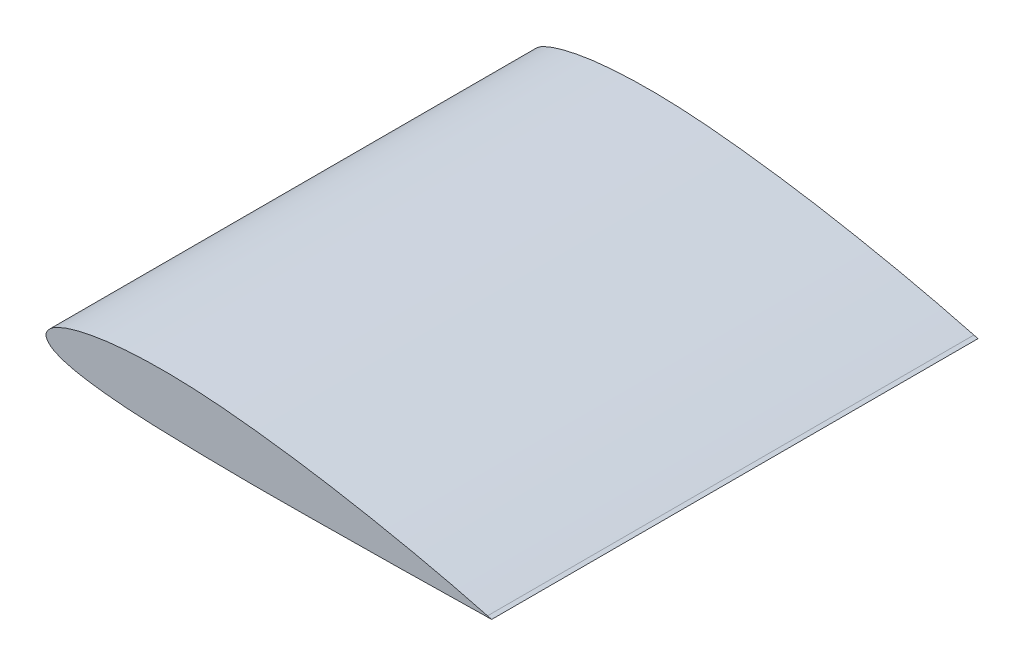
ISO-10303-21;
HEADER;
FILE_DESCRIPTION(('STEP AP214'),'2;1');
FILE_NAME('part.step','',(''),(''),'','','');
FILE_SCHEMA(('AUTOMOTIVE_DESIGN { 1 0 10303 214 1 1 1 1 }'));
ENDSEC;
DATA;
#1=APPLICATION_CONTEXT('core data for automotive mechanical design processes');
#2=APPLICATION_PROTOCOL_DEFINITION('international standard','automotive_design',2000,#1);
#3=PRODUCT_CONTEXT('',#1,'mechanical');
#4=PRODUCT('Part','Part','',(#3));
#5=PRODUCT_RELATED_PRODUCT_CATEGORY('part','',(#4));
#6=PRODUCT_DEFINITION_FORMATION('','',#4);
#7=PRODUCT_DEFINITION_CONTEXT('part definition',#1,'design');
#8=PRODUCT_DEFINITION('design','',#6,#7);
#9=PRODUCT_DEFINITION_SHAPE('','',#8);
#10=(LENGTH_UNIT() NAMED_UNIT(*) SI_UNIT(.MILLI.,.METRE.));
#11=(NAMED_UNIT(*) PLANE_ANGLE_UNIT() SI_UNIT($,.RADIAN.));
#12=(NAMED_UNIT(*) SI_UNIT($,.STERADIAN.) SOLID_ANGLE_UNIT());
#13=UNCERTAINTY_MEASURE_WITH_UNIT(LENGTH_MEASURE(1.E-05),#10,'distance_accuracy_value','');
#14=(GEOMETRIC_REPRESENTATION_CONTEXT(3) GLOBAL_UNCERTAINTY_ASSIGNED_CONTEXT((#13)) GLOBAL_UNIT_ASSIGNED_CONTEXT((#10,
#11,#12)) REPRESENTATION_CONTEXT('',''));
#15=CARTESIAN_POINT('',(0.,0.,0.));
#16=DIRECTION('',(0.,0.,1.));
#17=DIRECTION('',(1.,0.,0.));
#18=AXIS2_PLACEMENT_3D('',#15,#16,#17);
#19=CARTESIAN_POINT('',(0.391886291890149,8.13554028830415,335.28));
#20=DIRECTION('',(0.,0.,-1.));
#21=DIRECTION('',(-1.,0.,0.));
#22=AXIS2_PLACEMENT_3D('',#19,#20,#21);
#23=PLANE('',#22);
#24=CARTESIAN_POINT('',(304.402760330862,-9.20630944659419,335.28));
#25=CARTESIAN_POINT('',(299.386393305391,-7.90497481201767,335.28));
#26=CARTESIAN_POINT('',(289.366834347577,-5.30572339584777,335.28));
#27=CARTESIAN_POINT('',(269.292243904673,-0.455697423157408,335.28));
#28=CARTESIAN_POINT('',(244.157418672505,5.06781338310643,335.28));
#29=CARTESIAN_POINT('',(213.939526940218,11.0020798515505,335.28));
#30=CARTESIAN_POINT('',(183.689202989143,16.2123768076077,335.28));
#31=CARTESIAN_POINT('',(153.375306279358,20.4499536681621,335.28));
#32=CARTESIAN_POINT('',(123.023879434396,23.8279937515789,335.28));
#33=CARTESIAN_POINT('',(97.6387270802609,25.4476667217114,335.28));
#34=CARTESIAN_POINT('',(77.2944991132529,25.6578621472548,335.28));
#35=CARTESIAN_POINT('',(61.9927674424906,25.2150041123373,335.28));
#36=CARTESIAN_POINT('',(46.6346060614054,24.0544988743007,335.28));
#37=CARTESIAN_POINT('',(33.8125107720127,22.3102356550694,335.28));
#38=CARTESIAN_POINT('',(23.5489584859863,20.1172806172784,335.28));
#39=CARTESIAN_POINT('',(15.746504065811,18.0444487868224,335.28));
#40=CARTESIAN_POINT('',(9.09525196040015,15.5030225280142,335.28));
#41=CARTESIAN_POINT('',(3.3058423556047,12.3041122734786,335.28));
#42=CARTESIAN_POINT('',(-1.89753120359885,6.52319165220481,335.28));
#43=CARTESIAN_POINT('',(2.9085232795749,0.956438003309505,335.28));
#44=CARTESIAN_POINT('',(8.28725340148274,-1.74743197735782,335.28));
#45=CARTESIAN_POINT('',(14.6658603281018,-3.91997195654178,335.28));
#46=CARTESIAN_POINT('',(22.2470326391204,-5.63334611474105,335.28));
#47=CARTESIAN_POINT('',(32.3523061827,-7.28367259020146,335.28));
#48=CARTESIAN_POINT('',(44.99398695688,-8.805622753048,335.28));
#49=CARTESIAN_POINT('',(60.2092078821352,-9.94094448088815,335.28));
#50=CARTESIAN_POINT('',(75.4340153229212,-10.6803941835911,335.28));
#51=CARTESIAN_POINT('',(95.7508740799061,-11.2827014769947,335.28));
#52=CARTESIAN_POINT('',(121.162053183256,-11.7895849794283,335.28));
#53=CARTESIAN_POINT('',(151.674243405201,-11.9621327200227,335.28));
#54=CARTESIAN_POINT('',(182.199368639073,-11.7137346180102,335.28));
#55=CARTESIAN_POINT('',(212.733374886763,-11.3937300057121,335.28));
#56=CARTESIAN_POINT('',(243.273783292522,-11.0508435913844,335.28));
#57=CARTESIAN_POINT('',(268.724480055498,-10.5965099036701,335.28));
#58=CARTESIAN_POINT('',(289.088670202664,-10.2840400987377,335.28));
#59=CARTESIAN_POINT('',(299.270526365105,-10.0931440554488,335.28));
#60=CARTESIAN_POINT('',(304.361804055526,-9.99768947910446,335.28));
#61=B_SPLINE_CURVE_WITH_KNOTS('',3,(#24,#25,#26,#27,#28,#29,#30,#31,#32,#33,#34,#35,#36,#37,#38,
#39,#40,#41,#42,#43,#44,#45,#46,#47,#48,#49,#50,#51,#52,#53,#54,#55,#56,#57,#58,#59,#60),
.UNSPECIFIED.,.F.,.F.,(4,1,1,1,1,1,1,1,1,1,1,1,1,1,1,1,1,1,1,1,1,1,1,1,1,1,1,1,1,1,1,1,1,1,4),
(0.,0.0250124897498648,0.0499592861642578,0.0996729249269686,0.149206319909966,
0.198581096615965,0.247805170456833,0.296916574601493,0.345952721793533,0.370491625569911,
0.395091203654929,0.41981479582396,0.444798575016595,0.457489818915221,0.47040640543549,
0.483879408669829,0.491264120322896,0.503458853294665,0.513609129403887,0.520450990700287,
0.533235387615153,0.545691039147803,0.558031884237173,0.582609167247894,0.607134741746914,
0.631652079836766,0.656174271859652,0.705233949250519,0.754320378530032,0.803437363555032,
0.852566095729537,0.901700994033254,0.95084880933727,0.975422716989278,1.),.UNSPECIFIED.);
#62=CARTESIAN_POINT('',(304.402760330862,-9.20630944659418,335.28));
#63=VERTEX_POINT('',#62);
#64=CARTESIAN_POINT('',(304.361804055524,-9.99768947910449,335.28));
#65=VERTEX_POINT('',#64);
#66=EDGE_CURVE('E125',#63,#65,#61,.T.);
#67=ORIENTED_EDGE('',*,*,#66,.T.);
#68=DIRECTION('',(0.999824290409473,0.0187453542829436,0.));
#69=VECTOR('',#68,1.);
#70=CARTESIAN_POINT('',(304.361804055526,-9.99768947910445,335.28));
#71=LINE('',#70,#69);
#72=CARTESIAN_POINT('',(307.244987748225,-9.94363368119989,335.28));
#73=VERTEX_POINT('',#72);
#74=EDGE_CURVE('E91',#65,#73,#71,.T.);
#75=ORIENTED_EDGE('',*,*,#74,.T.);
#76=DIRECTION('',(-0.967959619448524,0.251105904186,0.));
#77=VECTOR('',#76,1.);
#78=CARTESIAN_POINT('',(307.244987748225,-9.94363368119989,335.28));
#79=LINE('',#78,#77);
#80=EDGE_CURVE('E12',#73,#63,#79,.T.);
#81=ORIENTED_EDGE('',*,*,#80,.T.);
#82=EDGE_LOOP('',(#67,#75,#81));
#83=FACE_BOUND('',#82,.T.);
#84=ADVANCED_FACE('F81',(#83),#23,.F.);
#85=CARTESIAN_POINT('',(0.391886291890299,8.13554028830413,0.));
#86=DIRECTION('',(0.,0.,-1.));
#87=DIRECTION('',(-1.,0.,0.));
#88=AXIS2_PLACEMENT_3D('',#85,#86,#87);
#89=PLANE('',#88);
#90=CARTESIAN_POINT('',(304.402760330862,-9.20630944659416,0.));
#91=CARTESIAN_POINT('',(299.386393305391,-7.90497481201767,0.));
#92=CARTESIAN_POINT('',(289.366834347576,-5.30572339584773,0.));
#93=CARTESIAN_POINT('',(269.292243904673,-0.455697423157407,0.));
#94=CARTESIAN_POINT('',(244.157418672506,5.06781338310638,0.));
#95=CARTESIAN_POINT('',(213.939526940218,11.0020798515505,0.));
#96=CARTESIAN_POINT('',(183.689202989144,16.2123768076077,0.));
#97=CARTESIAN_POINT('',(153.375306279359,20.449953668162,0.));
#98=CARTESIAN_POINT('',(123.023879434396,23.8279937515789,0.));
#99=CARTESIAN_POINT('',(97.6387270802611,25.4476667217114,0.));
#100=CARTESIAN_POINT('',(77.2944991132532,25.6578621472548,0.));
#101=CARTESIAN_POINT('',(61.9927674424909,25.2150041123372,0.));
#102=CARTESIAN_POINT('',(46.6346060614056,24.0544988743006,0.));
#103=CARTESIAN_POINT('',(33.8125107720129,22.3102356550695,0.));
#104=CARTESIAN_POINT('',(23.5489584859865,20.1172806172784,0.));
#105=CARTESIAN_POINT('',(15.7465040658111,18.0444487868223,0.));
#106=CARTESIAN_POINT('',(9.09525196040028,15.5030225280143,0.));
#107=CARTESIAN_POINT('',(3.30584235560485,12.3041122734786,0.));
#108=CARTESIAN_POINT('',(-1.89753120359871,6.5231916522048,0.));
#109=CARTESIAN_POINT('',(2.90852327957506,0.95643800330956,0.));
#110=CARTESIAN_POINT('',(8.2872534014829,-1.74743197735783,0.));
#111=CARTESIAN_POINT('',(14.6658603281019,-3.91997195654175,0.));
#112=CARTESIAN_POINT('',(22.2470326391206,-5.63334611474106,0.));
#113=CARTESIAN_POINT('',(32.3523061827003,-7.28367259020148,0.));
#114=CARTESIAN_POINT('',(44.9939869568802,-8.80562275304802,0.));
#115=CARTESIAN_POINT('',(60.2092078821354,-9.94094448088815,0.));
#116=CARTESIAN_POINT('',(75.4340153229215,-10.6803941835911,0.));
#117=CARTESIAN_POINT('',(95.7508740799065,-11.2827014769947,0.));
#118=CARTESIAN_POINT('',(121.162053183257,-11.7895849794283,0.));
#119=CARTESIAN_POINT('',(151.6742434052,-11.9621327200227,0.));
#120=CARTESIAN_POINT('',(182.199368639073,-11.7137346180102,0.));
#121=CARTESIAN_POINT('',(212.733374886763,-11.3937300057121,0.));
#122=CARTESIAN_POINT('',(243.273783292522,-11.0508435913844,0.));
#123=CARTESIAN_POINT('',(268.724480055498,-10.5965099036701,0.));
#124=CARTESIAN_POINT('',(289.088670202664,-10.2840400987377,0.));
#125=CARTESIAN_POINT('',(299.270526365105,-10.0931440554488,0.));
#126=CARTESIAN_POINT('',(304.361804055526,-9.99768947910447,0.));
#127=B_SPLINE_CURVE_WITH_KNOTS('',3,(#90,#91,#92,#93,#94,#95,#96,#97,#98,#99,#100,#101,#102,
#103,#104,#105,#106,#107,#108,#109,#110,#111,#112,#113,#114,#115,#116,#117,#118,#119,#120,#121,
#122,#123,#124,#125,#126),.UNSPECIFIED.,.F.,.F.,(4,1,1,1,1,1,1,1,1,1,1,1,1,1,1,1,1,1,1,1,1,1,1,
1,1,1,1,1,1,1,1,1,1,1,4),(0.,0.0250124897498648,0.0499592861642578,0.0996729249269686,
0.149206319909966,0.198581096615965,0.247805170456833,0.296916574601493,0.345952721793533,
0.370491625569911,0.395091203654929,0.41981479582396,0.444798575016595,0.457489818915221,
0.47040640543549,0.483879408669829,0.491264120322896,0.503458853294665,0.513609129403887,
0.520450990700287,0.533235387615153,0.545691039147803,0.558031884237173,0.582609167247894,
0.607134741746914,0.631652079836766,0.656174271859652,0.705233949250519,0.754320378530032,
0.803437363555032,0.852566095729537,0.901700994033254,0.95084880933727,0.975422716989278,1.),.UNSPECIFIED.);
#128=CARTESIAN_POINT('',(304.402760330862,-9.20630944659416,0.));
#129=VERTEX_POINT('',#128);
#130=CARTESIAN_POINT('',(304.361804055526,-9.99768947910447,0.));
#131=VERTEX_POINT('',#130);
#132=EDGE_CURVE('E123',#129,#131,#127,.T.);
#133=ORIENTED_EDGE('',*,*,#132,.F.);
#134=DIRECTION('',(-0.967959619448522,0.251105904186006,0.));
#135=VECTOR('',#134,1.);
#136=CARTESIAN_POINT('',(304.402760330862,-9.20630944659416,0.));
#137=LINE('',#136,#135);
#138=CARTESIAN_POINT('',(307.244987748225,-9.94363368119992,0.));
#139=VERTEX_POINT('',#138);
#140=EDGE_CURVE('E128',#139,#129,#137,.T.);
#141=ORIENTED_EDGE('',*,*,#140,.F.);
#142=DIRECTION('',(0.999824290409473,0.0187453542829421,0.));
#143=VECTOR('',#142,1.);
#144=CARTESIAN_POINT('',(307.244987748225,-9.94363368119992,0.));
#145=LINE('',#144,#143);
#146=EDGE_CURVE('E134',#131,#139,#145,.T.);
#147=ORIENTED_EDGE('',*,*,#146,.F.);
#148=EDGE_LOOP('',(#133,#141,#147));
#149=FACE_BOUND('',#148,.T.);
#150=ADVANCED_FACE('F138',(#149),#89,.T.);
#151=CARTESIAN_POINT('',(304.402760330862,-9.20630944659416,0.));
#152=CARTESIAN_POINT('',(304.402760330862,-9.20630944659419,335.28));
#153=CARTESIAN_POINT('',(301.266510761918,-8.39271064769866,0.));
#154=CARTESIAN_POINT('',(301.266510761918,-8.39271064769866,335.28));
#155=CARTESIAN_POINT('',(294.994284138827,-6.76444409501857,0.));
#156=CARTESIAN_POINT('',(294.994284138828,-6.76444409501858,335.28));
#157=CARTESIAN_POINT('',(285.568661220943,-4.38921575994504,0.));
#158=CARTESIAN_POINT('',(285.568661220943,-4.38921575994503,335.28));
#159=CARTESIAN_POINT('',(276.117955357118,-2.11571471277312,0.));
#160=CARTESIAN_POINT('',(276.117955357118,-2.11571471277321,335.28));
#161=CARTESIAN_POINT('',(266.648217750481,0.0768159385033066,0.));
#162=CARTESIAN_POINT('',(266.648217750481,0.0768159385032667,335.28));
#163=CARTESIAN_POINT('',(257.160348537304,2.18967346189361,0.));
#164=CARTESIAN_POINT('',(257.160348537304,2.18967346189354,335.28));
#165=CARTESIAN_POINT('',(247.656518761221,4.22934208634519,0.));
#166=CARTESIAN_POINT('',(247.656518761222,4.22934208634511,335.28));
#167=CARTESIAN_POINT('',(238.138158778443,6.20013522855951,0.));
#168=CARTESIAN_POINT('',(238.138158778443,6.20013522855941,335.28));
#169=CARTESIAN_POINT('',(228.606164471254,8.10386014301639,0.));
#170=CARTESIAN_POINT('',(228.606164471254,8.1038601430163,335.28));
#171=CARTESIAN_POINT('',(219.060535904494,9.93802983943854,0.));
#172=CARTESIAN_POINT('',(219.060535904495,9.93802983943844,335.28));
#173=CARTESIAN_POINT('',(209.501882043381,11.7030672087625,0.));
#174=CARTESIAN_POINT('',(209.501882043382,11.7030672087625,335.28));
#175=CARTESIAN_POINT('',(199.92985311861,13.3941380579976,0.));
#176=CARTESIAN_POINT('',(199.92985311861,13.3941380579975,335.28));
#177=CARTESIAN_POINT('',(190.343617483244,15.0028747008963,0.));
#178=CARTESIAN_POINT('',(190.343617483243,15.0028747008962,335.28));
#179=CARTESIAN_POINT('',(180.742470752196,16.5201692299163,0.));
#180=CARTESIAN_POINT('',(180.742470752197,16.5201692299163,335.28));
#181=CARTESIAN_POINT('',(171.126579600997,17.941068761341,0.));
#182=CARTESIAN_POINT('',(171.126579600997,17.9410687613409,335.28));
#183=CARTESIAN_POINT('',(161.497546721607,19.2698647981406,0.));
#184=CARTESIAN_POINT('',(161.497546721608,19.2698647981406,335.28));
#185=CARTESIAN_POINT('',(151.856741940817,20.510306585202,0.));
#186=CARTESIAN_POINT('',(151.856741940816,20.5103065852019,335.28));
#187=CARTESIAN_POINT('',(142.205054122065,21.6631790027971,0.));
#188=CARTESIAN_POINT('',(142.205054122065,21.6631790027971,335.28));
#189=CARTESIAN_POINT('',(132.540979503285,22.7077687846837,0.));
#190=CARTESIAN_POINT('',(132.540979503285,22.7077687846836,335.28));
#191=CARTESIAN_POINT('',(122.864020673809,23.6259001807079,0.));
#192=CARTESIAN_POINT('',(122.864020673809,23.625900180708,335.28));
#193=CARTESIAN_POINT('',(113.174250358081,24.3982191403114,0.));
#194=CARTESIAN_POINT('',(113.174250358081,24.3982191403113,335.279999999999));
#195=CARTESIAN_POINT('',(105.089337160493,24.9006258286772,0.));
#196=CARTESIAN_POINT('',(105.089337160493,24.9006258286772,335.280000000001));
#197=CARTESIAN_POINT('',(98.6163061153764,25.2057432680527,0.));
#198=CARTESIAN_POINT('',(98.6163061153766,25.2057432680527,335.28));
#199=CARTESIAN_POINT('',(93.7593890664865,25.3832476901494,0.));
#200=CARTESIAN_POINT('',(93.7593890664864,25.3832476901495,335.28));
#201=CARTESIAN_POINT('',(88.9007721641182,25.5062344054871,0.));
#202=CARTESIAN_POINT('',(88.9007721641183,25.506234405487,335.28));
#203=CARTESIAN_POINT('',(84.0410508960298,25.5727107153145,0.));
#204=CARTESIAN_POINT('',(84.0410508960298,25.5727107153145,335.28));
#205=CARTESIAN_POINT('',(79.1808762191102,25.5808897251505,0.));
#206=CARTESIAN_POINT('',(79.1808762191102,25.5808897251505,335.28));
#207=CARTESIAN_POINT('',(74.3209630105934,25.5291524352373,0.));
#208=CARTESIAN_POINT('',(74.3209630105934,25.5291524352374,335.28));
#209=CARTESIAN_POINT('',(69.4621117739857,25.414717293562,0.));
#210=CARTESIAN_POINT('',(69.4621117739859,25.4147172935621,335.28));
#211=CARTESIAN_POINT('',(64.6052628297273,25.2339003320377,0.));
#212=CARTESIAN_POINT('',(64.6052628297273,25.2339003320377,335.28));
#213=CARTESIAN_POINT('',(59.7514957097872,24.9835066109058,0.));
#214=CARTESIAN_POINT('',(59.7514957097873,24.9835066109058,335.280000000001));
#215=CARTESIAN_POINT('',(54.9020806484464,24.6591411180085,0.));
#216=CARTESIAN_POINT('',(54.9020806484466,24.6591411180087,335.28));
#217=CARTESIAN_POINT('',(50.0587506813061,24.2536656616004,0.));
#218=CARTESIAN_POINT('',(50.0587506813059,24.2536656616004,335.280000000001));
#219=CARTESIAN_POINT('',(45.2233445387785,23.7623974286443,0.));
#220=CARTESIAN_POINT('',(45.2233445387788,23.7623974286445,335.279999999999));
#221=CARTESIAN_POINT('',(40.3985359966686,23.1754979793704,0.));
#222=CARTESIAN_POINT('',(40.3985359966686,23.1754979793704,335.280000000001));
#223=CARTESIAN_POINT('',(35.5890346152847,22.4732204650148,0.));
#224=CARTESIAN_POINT('',(35.5890346152847,22.4732204650149,335.28));
#225=CARTESIAN_POINT('',(31.5988198962123,21.7768696073492,0.));
#226=CARTESIAN_POINT('',(31.5988198962123,21.7768696073491,335.28));
#227=CARTESIAN_POINT('',(28.4209529521506,21.1444657553847,0.));
#228=CARTESIAN_POINT('',(28.4209529521506,21.1444657553848,335.28));
#229=CARTESIAN_POINT('',(26.0450780713699,20.6339376105933,0.));
#230=CARTESIAN_POINT('',(26.0450780713698,20.6339376105932,335.28));
#231=CARTESIAN_POINT('',(23.6772631714485,20.0871952646531,0.));
#232=CARTESIAN_POINT('',(23.6772631714486,20.0871952646532,335.28));
#233=CARTESIAN_POINT('',(21.3178767904772,19.5051299766339,0.));
#234=CARTESIAN_POINT('',(21.3178767904771,19.5051299766339,335.28));
#235=CARTESIAN_POINT('',(18.9705130868034,18.8759922318504,0.));
#236=CARTESIAN_POINT('',(18.9705130868035,18.8759922318506,335.28));
#237=CARTESIAN_POINT('',(16.6395764126752,18.1882936804535,0.));
#238=CARTESIAN_POINT('',(16.6395764126752,18.1882936804535,335.28));
#239=CARTESIAN_POINT('',(14.3298819819967,17.4319931748298,0.));
#240=CARTESIAN_POINT('',(14.3298819819968,17.4319931748299,335.28));
#241=CARTESIAN_POINT('',(12.0473799733319,16.5969750597543,0.));
#242=CARTESIAN_POINT('',(12.047379973332,16.5969750597544,335.28));
#243=CARTESIAN_POINT('',(10.174299003681,15.8260381384748,0.));
#244=CARTESIAN_POINT('',(10.1742990036811,15.8260381384748,335.28));
#245=CARTESIAN_POINT('',(8.6990315042318,15.156320212604,0.));
#246=CARTESIAN_POINT('',(8.69903150423186,15.1563202126041,335.28));
#247=CARTESIAN_POINT('',(7.60533738183875,14.6268311530041,0.));
#248=CARTESIAN_POINT('',(7.6053373818387,14.6268311530041,335.280000000001));
#249=CARTESIAN_POINT('',(6.52968956438763,14.0612338986911,0.));
#250=CARTESIAN_POINT('',(6.52968956438767,14.0612338986912,335.279999999999));
#251=CARTESIAN_POINT('',(5.48393300410258,13.4416397513992,0.));
#252=CARTESIAN_POINT('',(5.48393300410245,13.4416397513991,335.280000000001));
#253=CARTESIAN_POINT('',(4.47769255546321,12.7594361285564,0.));
#254=CARTESIAN_POINT('',(4.47769255546317,12.7594361285565,335.28));
#255=CARTESIAN_POINT('',(3.51875431478435,12.0123322436901,0.));
#256=CARTESIAN_POINT('',(3.51875431478442,12.0123322436903,335.280000000001));
#257=CARTESIAN_POINT('',(2.6129936625459,11.2010081767813,0.));
#258=CARTESIAN_POINT('',(2.61299366254587,11.2010081767814,335.28));
#259=CARTESIAN_POINT('',(1.77608285003427,10.3188876493247,0.));
#260=CARTESIAN_POINT('',(1.77608285003423,10.3188876493248,335.280000000001));
#261=CARTESIAN_POINT('',(1.03044983590559,9.35650465229281,0.));
#262=CARTESIAN_POINT('',(1.03044983590559,9.35650465229306,335.28));
#263=CARTESIAN_POINT('',(0.423133789501755,8.30045108671087,0.));
#264=CARTESIAN_POINT('',(0.423133789501639,8.300451086711,335.28));
#265=CARTESIAN_POINT('',(0.0217638500379417,7.14476908227274,0.));
#266=CARTESIAN_POINT('',(0.0217638500378415,7.14476908227285,335.28));
#267=CARTESIAN_POINT('',(-0.0423180522727071,5.91536380697633,0.));
#268=CARTESIAN_POINT('',(-0.0423180522728956,5.9153638069765,335.28));
#269=CARTESIAN_POINT('',(0.29253474378362,4.7331255691217,0.));
#270=CARTESIAN_POINT('',(0.292534743783456,4.73312556912177,335.28));
#271=CARTESIAN_POINT('',(0.87158088383044,3.66133307648774,0.));
#272=CARTESIAN_POINT('',(0.87158088383016,3.66133307648792,335.28));
#273=CARTESIAN_POINT('',(1.61207254777392,2.69325320375225,0.));
#274=CARTESIAN_POINT('',(1.61207254777364,2.69325320375237,335.28));
#275=CARTESIAN_POINT('',(2.45894697336699,1.82058097902037,0.));
#276=CARTESIAN_POINT('',(2.45894697336673,1.82058097902043,335.28));
#277=CARTESIAN_POINT('',(3.38650088626964,1.03324061331165,0.));
#278=CARTESIAN_POINT('',(3.38650088626942,1.03324061331166,335.28));
#279=CARTESIAN_POINT('',(4.38053935064473,0.332864084294105,0.));
#280=CARTESIAN_POINT('',(4.38053935064453,0.332864084294103,335.28));
#281=CARTESIAN_POINT('',(5.42961682674441,-0.28221115134211,0.));
#282=CARTESIAN_POINT('',(5.42961682674418,-0.282211151342092,335.28));
#283=CARTESIAN_POINT('',(6.51718869402174,-0.824770513555301,0.));
#284=CARTESIAN_POINT('',(6.5171886940215,-0.824770513555275,335.280000000001));
#285=CARTESIAN_POINT('',(7.62691437452358,-1.31998895587746,0.));
#286=CARTESIAN_POINT('',(7.6269143745234,-1.31998895587745,335.279999999999));
#287=CARTESIAN_POINT('',(9.12286226665608,-1.94209882491988,0.));
#288=CARTESIAN_POINT('',(9.12286226665593,-1.94209882491989,335.280000000001));
#289=CARTESIAN_POINT('',(11.0214024308684,-2.64826605939764,0.));
#290=CARTESIAN_POINT('',(11.0214024308681,-2.64826605939762,335.279999999999));
#291=CARTESIAN_POINT('',(13.3331257996457,-3.39869054847369,0.));
#292=CARTESIAN_POINT('',(13.3331257996457,-3.39869054847373,335.280000000001));
#293=CARTESIAN_POINT('',(15.6703346978839,-4.06529403287211,0.));
#294=CARTESIAN_POINT('',(15.6703346978835,-4.06529403287208,335.28));
#295=CARTESIAN_POINT('',(18.0269449101951,-4.6591776570408,0.));
#296=CARTESIAN_POINT('',(18.0269449101949,-4.6591776570408,335.28));
#297=CARTESIAN_POINT('',(20.3987735192405,-5.18882726592195,0.));
#298=CARTESIAN_POINT('',(20.3987735192404,-5.18882726592197,335.28));
#299=CARTESIAN_POINT('',(22.7818612757018,-5.66485331163947,0.));
#300=CARTESIAN_POINT('',(22.7818612757016,-5.66485331163946,335.28));
#301=CARTESIAN_POINT('',(25.173236187818,-6.09714287808832,0.));
#302=CARTESIAN_POINT('',(25.1732361878178,-6.0971428780883,335.28));
#303=CARTESIAN_POINT('',(27.5708604569774,-6.49310704387246,0.));
#304=CARTESIAN_POINT('',(27.5708604569772,-6.49310704387245,335.28));
#305=CARTESIAN_POINT('',(29.972999903905,-6.86051453714591,0.));
#306=CARTESIAN_POINT('',(29.9729999039048,-6.86051453714591,335.28));
#307=CARTESIAN_POINT('',(33.1800403427352,-7.32212476052602,0.));
#308=CARTESIAN_POINT('',(33.1800403427349,-7.32212476052597,335.28));
#309=CARTESIAN_POINT('',(37.1960986387692,-7.84707057713717,0.));
#310=CARTESIAN_POINT('',(37.1960986387689,-7.84707057713717,335.28));
#311=CARTESIAN_POINT('',(42.0248816309393,-8.3991639930456,0.));
#312=CARTESIAN_POINT('',(42.024881630939,-8.39916399304555,335.28));
#313=CARTESIAN_POINT('',(46.8614733688227,-8.87784868811453,0.));
#314=CARTESIAN_POINT('',(46.8614733688223,-8.87784868811454,335.28));
#315=CARTESIAN_POINT('',(51.704159817043,-9.28998500110445,0.));
#316=CARTESIAN_POINT('',(51.7041598170427,-9.28998500110441,335.280000000001));
#317=CARTESIAN_POINT('',(56.5513101368127,-9.64533400917208,0.));
#318=CARTESIAN_POINT('',(56.5513101368123,-9.64533400917209,335.279999999999));
#319=CARTESIAN_POINT('',(61.4016615356822,-9.95359758733342,0.));
#320=CARTESIAN_POINT('',(61.4016615356821,-9.9535975873334,335.280000000001));
#321=CARTESIAN_POINT('',(66.2543086657487,-10.2230968004507,0.));
#322=CARTESIAN_POINT('',(66.2543086657484,-10.2230968004507,335.28));
#323=CARTESIAN_POINT('',(71.1088188283724,-10.4565778753995,0.));
#324=CARTESIAN_POINT('',(71.1088188283724,-10.4565778753995,335.28));
#325=CARTESIAN_POINT('',(75.9647671181188,-10.6577550817336,0.));
#326=CARTESIAN_POINT('',(75.9647671181184,-10.6577550817336,335.28));
#327=CARTESIAN_POINT('',(80.8218167560276,-10.8301563051515,0.));
#328=CARTESIAN_POINT('',(80.8218167560277,-10.8301563051515,335.28));
#329=CARTESIAN_POINT('',(85.6795997490487,-10.9801849536542,0.));
#330=CARTESIAN_POINT('',(85.6795997490485,-10.9801849536542,335.28));
#331=CARTESIAN_POINT('',(90.5378562309922,-11.1138405300945,0.));
#332=CARTESIAN_POINT('',(90.537856230992,-11.1138405300945,335.28));
#333=CARTESIAN_POINT('',(95.3963769145079,-11.2374181654122,0.));
#334=CARTESIAN_POINT('',(95.396376914508,-11.2374181654123,335.28));
#335=CARTESIAN_POINT('',(100.25514633283,-11.3508501440729,0.));
#336=CARTESIAN_POINT('',(100.25514633283,-11.3508501440729,335.28));
#337=CARTESIAN_POINT('',(105.114145875396,-11.4539250329824,0.));
#338=CARTESIAN_POINT('',(105.114145875396,-11.4539250329824,335.28));
#339=CARTESIAN_POINT('',(111.593094420169,-11.5773678182527,0.));
#340=CARTESIAN_POINT('',(111.593094420169,-11.5773678182527,335.28));
#341=CARTESIAN_POINT('',(119.692259907737,-11.7049476261094,0.));
#342=CARTESIAN_POINT('',(119.692259907737,-11.7049476261095,335.28));
#343=CARTESIAN_POINT('',(129.411855298117,-11.8140095086016,0.));
#344=CARTESIAN_POINT('',(129.411855298117,-11.8140095086016,335.28));
#345=CARTESIAN_POINT('',(139.131841818301,-11.8789444876329,0.));
#346=CARTESIAN_POINT('',(139.131841818301,-11.878944487633,335.28));
#347=CARTESIAN_POINT('',(148.852023310188,-11.9010026024301,0.));
#348=CARTESIAN_POINT('',(148.852023310188,-11.9010026024301,335.28));
#349=CARTESIAN_POINT('',(158.572200322179,-11.8792116219705,0.));
#350=CARTESIAN_POINT('',(158.572200322179,-11.8792116219705,335.279999999999));
#351=CARTESIAN_POINT('',(168.292225479559,-11.8222635425676,0.));
#352=CARTESIAN_POINT('',(168.292225479559,-11.8222635425676,335.28));
#353=CARTESIAN_POINT('',(178.012076378362,-11.7418628655629,0.));
#354=CARTESIAN_POINT('',(178.012076378362,-11.7418628655629,335.28));
#355=CARTESIAN_POINT('',(187.731823667175,-11.6500361847264,0.));
#356=CARTESIAN_POINT('',(187.731823667175,-11.6500361847264,335.28));
#357=CARTESIAN_POINT('',(197.451518686122,-11.5528741042434,0.));
#358=CARTESIAN_POINT('',(197.451518686121,-11.5528741042434,335.28));
#359=CARTESIAN_POINT('',(207.17115714329,-11.4502173661941,0.));
#360=CARTESIAN_POINT('',(207.17115714329,-11.4502173661941,335.279999999999));
#361=CARTESIAN_POINT('',(216.890770926729,-11.3452589037019,0.));
#362=CARTESIAN_POINT('',(216.890770926729,-11.3452589037019,335.280000000001));
#363=CARTESIAN_POINT('',(226.610336029425,-11.2358677442312,0.));
#364=CARTESIAN_POINT('',(226.610336029425,-11.2358677442312,335.279999999999));
#365=CARTESIAN_POINT('',(236.329780670761,-11.1160596588711,0.));
#366=CARTESIAN_POINT('',(236.329780670761,-11.1160596588711,335.280000000001));
#367=CARTESIAN_POINT('',(246.049002245184,-10.9792045896822,0.));
#368=CARTESIAN_POINT('',(246.049002245185,-10.9792045896822,335.28));
#369=CARTESIAN_POINT('',(255.767933980724,-10.823192184361,0.));
#370=CARTESIAN_POINT('',(255.767933980723,-10.8231921843609,335.28));
#371=CARTESIAN_POINT('',(265.486741528335,-10.6599085349233,0.));
#372=CARTESIAN_POINT('',(265.486741528335,-10.6599085349233,335.28));
#373=CARTESIAN_POINT('',(275.205580814802,-10.4983657997458,0.));
#374=CARTESIAN_POINT('',(275.205580814802,-10.4983657997457,335.280000000001));
#375=CARTESIAN_POINT('',(284.924592033544,-10.3475407097028,0.));
#376=CARTESIAN_POINT('',(284.924592033544,-10.3475407097028,335.279999999999));
#377=CARTESIAN_POINT('',(294.64334070486,-10.1803595623008,0.));
#378=CARTESIAN_POINT('',(294.64334070486,-10.1803595623008,335.280000000001));
#379=CARTESIAN_POINT('',(301.122310964272,-10.0584255967155,0.));
#380=CARTESIAN_POINT('',(301.122310964272,-10.0584255967155,335.28));
#381=CARTESIAN_POINT('',(304.602069363251,-9.99318482927909,0.));
#382=CARTESIAN_POINT('',(304.602069363251,-9.99318482927907,335.28));
#383=CARTESIAN_POINT('',(305.0825999787,-9.98417552962835,0.));
#384=CARTESIAN_POINT('',(305.0825999787,-9.98417552962832,335.28));
#385=CARTESIAN_POINT('',(305.803395901876,-9.97066158015218,0.));
#386=CARTESIAN_POINT('',(305.803395901876,-9.97066158015216,335.28));
#387=CARTESIAN_POINT('',(306.52419182505,-9.95714763067607,0.));
#388=CARTESIAN_POINT('',(306.52419182505,-9.95714763067604,335.28));
#389=CARTESIAN_POINT('',(307.0047224405,-9.9481383310253,0.));
#390=CARTESIAN_POINT('',(307.0047224405,-9.94813833102527,335.28));
#391=CARTESIAN_POINT('',(307.244987748225,-9.94363368119992,0.));
#392=CARTESIAN_POINT('',(307.244987748225,-9.94363368119989,335.28));
#393=B_SPLINE_SURFACE_WITH_KNOTS('',3,1,((#151,#152),(#153,#154),(#155,#156),(#157,#158),(#159,
#160),(#161,#162),(#163,#164),(#165,#166),(#167,#168),(#169,#170),(#171,#172),(#173,#174),(#175,
#176),(#177,#178),(#179,#180),(#181,#182),(#183,#184),(#185,#186),(#187,#188),(#189,#190),(#191,
#192),(#193,#194),(#195,#196),(#197,#198),(#199,#200),(#201,#202),(#203,#204),(#205,#206),(#207,
#208),(#209,#210),(#211,#212),(#213,#214),(#215,#216),(#217,#218),(#219,#220),(#221,#222),(#223,
#224),(#225,#226),(#227,#228),(#229,#230),(#231,#232),(#233,#234),(#235,#236),(#237,#238),(#239,
#240),(#241,#242),(#243,#244),(#245,#246),(#247,#248),(#249,#250),(#251,#252),(#253,#254),(#255,
#256),(#257,#258),(#259,#260),(#261,#262),(#263,#264),(#265,#266),(#267,#268),(#269,#270),(#271,
#272),(#273,#274),(#275,#276),(#277,#278),(#279,#280),(#281,#282),(#283,#284),(#285,#286),(#287,
#288),(#289,#290),(#291,#292),(#293,#294),(#295,#296),(#297,#298),(#299,#300),(#301,#302),(#303,
#304),(#305,#306),(#307,#308),(#309,#310),(#311,#312),(#313,#314),(#315,#316),(#317,#318),(#319,
#320),(#321,#322),(#323,#324),(#325,#326),(#327,#328),(#329,#330),(#331,#332),(#333,#334),(#335,
#336),(#337,#338),(#339,#340),(#341,#342),(#343,#344),(#345,#346),(#347,#348),(#349,#350),(#351,
#352),(#353,#354),(#355,#356),(#357,#358),(#359,#360),(#361,#362),(#363,#364),(#365,#366),(#367,
#368),(#369,#370),(#371,#372),(#373,#374),(#375,#376),(#377,#378),(#379,#380),(#381,#382),(#383,
#384),(#385,#386),(#387,#388),(#389,#390),(#391,#392)),.UNSPECIFIED.,.F.,.F.,.F.,(4,1,1,1,1,1,1,
1,1,1,1,1,1,1,1,1,1,1,1,1,1,1,1,1,1,1,1,1,1,1,1,1,1,1,1,1,1,1,1,1,1,1,1,1,1,1,1,1,1,1,1,1,1,1,1,
1,1,1,1,1,1,1,1,1,1,1,1,1,1,1,1,1,1,1,1,1,1,1,1,1,1,1,1,1,1,1,1,1,1,1,1,1,1,1,1,1,1,1,1,1,1,1,1,
1,1,1,1,1,1,1,1,1,1,2,1,1,1,4),(2,2),(0.,0.0155529052140533,0.0311058104281065,
0.0466587156421598,0.0622116208562131,0.0777645260702663,0.0933174312843196,0.108870336498373,
0.124423241712426,0.139976146926479,0.155529052140533,0.171081957354586,0.186634862568639,
0.202187767782692,0.217740672996746,0.233293578210799,0.248846483424852,0.264399388638905,
0.279952293852959,0.295505199067012,0.311058104281065,0.326611009495119,0.334387462102145,
0.342163914709172,0.349940367316198,0.357716819923225,0.365493272530252,0.373269725137278,
0.381046177744305,0.388822630351332,0.396599082958358,0.404375535565385,0.412151988172412,
0.419928440779438,0.427704893386465,0.435481345993491,0.443257798600518,0.447146024904031,
0.451034251207545,0.454922477511058,0.458810703814571,0.462698930118085,0.466587156421598,
0.470475382725111,0.474363609028624,0.478251835332138,0.480195948483895,0.482140061635651,
0.484084174787408,0.486028287939165,0.487972401090921,0.489916514242678,0.491860627394435,
0.493804740546191,0.495748853697948,0.497692966849704,0.499637080001461,0.501581193153218,
0.503525306304974,0.505469419456731,0.507413532608488,0.509357645760244,0.511301758912001,
0.513245872063758,0.515189985215514,0.517134098367271,0.519078211519028,0.521022324670784,
0.524910550974298,0.528798777277811,0.532687003581324,0.536575229884838,0.540463456188351,
0.544351682491864,0.548239908795378,0.552128135098891,0.556016361402404,0.559904587705918,
0.567681040312944,0.575457492919971,0.583233945526997,0.591010398134024,0.598786850741051,
0.606563303348077,0.614339755955104,0.622116208562131,0.629892661169157,0.637669113776184,
0.64544556638321,0.653222018990237,0.660998471597264,0.66877492420429,0.676551376811317,
0.684327829418344,0.699880734632397,0.71543363984645,0.730986545060503,0.746539450274557,
0.76209235548861,0.777645260702663,0.793198165916717,0.80875107113077,0.824303976344823,
0.839856881558876,0.85540978677293,0.870962691986983,0.886515597201036,0.902068502415089,
0.917621407629143,0.933174312843196,0.948727218057249,0.964280123271302,0.979833028485356,
0.995385933699409,0.996539450274557,0.997692966849705,0.998846483424852,1.),(0.,1.),.UNSPECIFIED.);
#394=DIRECTION('',(0.,0.,1.));
#395=VECTOR('',#394,1.);
#396=CARTESIAN_POINT('',(307.244987748225,-9.94363368119991,167.64));
#397=LINE('',#396,#395);
#398=EDGE_CURVE('E106',#139,#73,#397,.T.);
#399=DIRECTION('',(0.,0.,-1.));
#400=VECTOR('',#399,1.);
#401=CARTESIAN_POINT('',(304.402760330862,-9.20630944659417,167.64));
#402=LINE('',#401,#400);
#403=EDGE_CURVE('E119',#63,#129,#402,.T.);
#404=ORIENTED_EDGE('',*,*,#132,.T.);
#405=ORIENTED_EDGE('',*,*,#146,.T.);
#406=ORIENTED_EDGE('',*,*,#398,.T.);
#407=ORIENTED_EDGE('',*,*,#74,.F.);
#408=ORIENTED_EDGE('',*,*,#66,.F.);
#409=ORIENTED_EDGE('',*,*,#403,.T.);
#410=EDGE_LOOP('',(#404,#405,#406,#407,#408,#409));
#411=FACE_BOUND('',#410,.T.);
#412=ADVANCED_FACE('F121',(#411),#393,.T.);
#413=CARTESIAN_POINT('',(307.244987748225,-9.94363368119992,0.));
#414=DIRECTION('',(0.251105904186006,0.967959619448522,0.));
#415=DIRECTION('',(-0.967959619448522,0.251105904186006,0.));
#416=AXIS2_PLACEMENT_3D('',#413,#414,#415);
#417=PLANE('',#416);
#418=ORIENTED_EDGE('',*,*,#140,.T.);
#419=ORIENTED_EDGE('',*,*,#403,.F.);
#420=ORIENTED_EDGE('',*,*,#80,.F.);
#421=ORIENTED_EDGE('',*,*,#398,.F.);
#422=EDGE_LOOP('',(#418,#419,#420,#421));
#423=FACE_BOUND('',#422,.T.);
#424=ADVANCED_FACE('F131',(#423),#417,.T.);
#425=CLOSED_SHELL('',(#84,#150,#412,#424));
#426=MANIFOLD_SOLID_BREP('B2',#425);
#427=ADVANCED_BREP_SHAPE_REPRESENTATION('',(#18,#426),#14);
#428=SHAPE_DEFINITION_REPRESENTATION(#9,#427);
ENDSEC;
END-ISO-10303-21;
